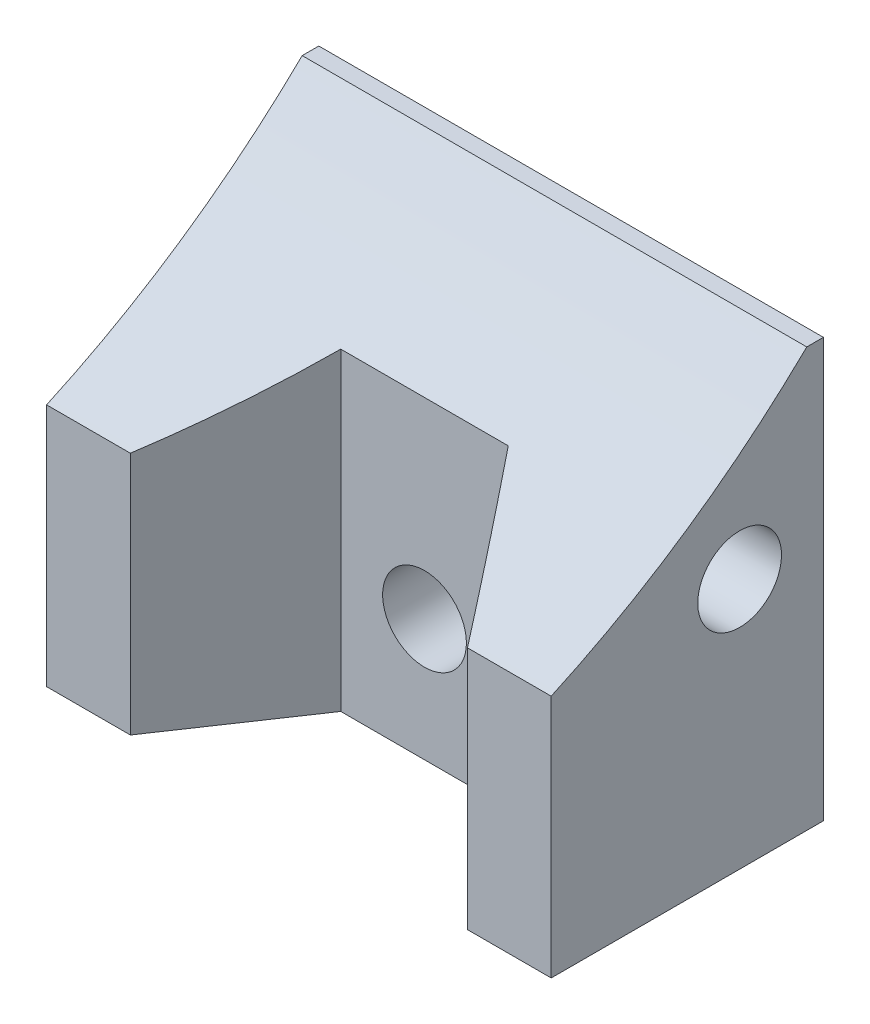
ISO-10303-21;
HEADER;
FILE_DESCRIPTION(('STEP AP214'),'2;1');
FILE_NAME('part.step','',(''),(''),'','','');
FILE_SCHEMA(('AUTOMOTIVE_DESIGN { 1 0 10303 214 1 1 1 1 }'));
ENDSEC;
DATA;
#1=APPLICATION_CONTEXT('core data for automotive mechanical design processes');
#2=APPLICATION_PROTOCOL_DEFINITION('international standard','automotive_design',2000,#1);
#3=PRODUCT_CONTEXT('',#1,'mechanical');
#4=PRODUCT('Part','Part','',(#3));
#5=PRODUCT_RELATED_PRODUCT_CATEGORY('part','',(#4));
#6=PRODUCT_DEFINITION_FORMATION('','',#4);
#7=PRODUCT_DEFINITION_CONTEXT('part definition',#1,'design');
#8=PRODUCT_DEFINITION('design','',#6,#7);
#9=PRODUCT_DEFINITION_SHAPE('','',#8);
#10=(LENGTH_UNIT() NAMED_UNIT(*) SI_UNIT(.MILLI.,.METRE.));
#11=(NAMED_UNIT(*) PLANE_ANGLE_UNIT() SI_UNIT($,.RADIAN.));
#12=(NAMED_UNIT(*) SI_UNIT($,.STERADIAN.) SOLID_ANGLE_UNIT());
#13=UNCERTAINTY_MEASURE_WITH_UNIT(LENGTH_MEASURE(1.E-05),#10,'distance_accuracy_value','');
#14=(GEOMETRIC_REPRESENTATION_CONTEXT(3) GLOBAL_UNCERTAINTY_ASSIGNED_CONTEXT((#13)) GLOBAL_UNIT_ASSIGNED_CONTEXT((#10,
#11,#12)) REPRESENTATION_CONTEXT('',''));
#15=CARTESIAN_POINT('',(0.,0.,0.));
#16=DIRECTION('',(0.,0.,1.));
#17=DIRECTION('',(1.,0.,0.));
#18=AXIS2_PLACEMENT_3D('',#15,#16,#17);
#19=CARTESIAN_POINT('',(0.,0.,13.));
#20=DIRECTION('',(0.,0.,1.));
#21=DIRECTION('',(1.,0.,0.));
#22=AXIS2_PLACEMENT_3D('',#19,#20,#21);
#23=PLANE('',#22);
#24=DIRECTION('',(1.,0.,0.));
#25=VECTOR('',#24,1.);
#26=CARTESIAN_POINT('',(-12.05,1.65718456727979,13.));
#27=LINE('',#26,#25);
#28=CARTESIAN_POINT('',(8.05000000000002,1.65718456727979,13.));
#29=VERTEX_POINT('',#28);
#30=CARTESIAN_POINT('',(12.05,1.65718456727979,13.));
#31=VERTEX_POINT('',#30);
#32=EDGE_CURVE('E143',#29,#31,#27,.T.);
#33=ORIENTED_EDGE('',*,*,#32,.F.);
#34=DIRECTION('',(0.,-1.,0.));
#35=VECTOR('',#34,1.);
#36=CARTESIAN_POINT('',(8.05,10.,13.));
#37=LINE('',#36,#35);
#38=CARTESIAN_POINT('',(8.05,-10.,13.));
#39=VERTEX_POINT('',#38);
#40=EDGE_CURVE('E49',#29,#39,#37,.T.);
#41=ORIENTED_EDGE('',*,*,#40,.T.);
#42=DIRECTION('',(1.,0.,0.));
#43=VECTOR('',#42,1.);
#44=CARTESIAN_POINT('',(-12.05,-10.,13.));
#45=LINE('',#44,#43);
#46=CARTESIAN_POINT('',(12.05,-10.,13.));
#47=VERTEX_POINT('',#46);
#48=EDGE_CURVE('E126',#39,#47,#45,.T.);
#49=ORIENTED_EDGE('',*,*,#48,.T.);
#50=DIRECTION('',(0.,1.,0.));
#51=VECTOR('',#50,1.);
#52=CARTESIAN_POINT('',(12.05,10.,13.));
#53=LINE('',#52,#51);
#54=EDGE_CURVE('E151',#47,#31,#53,.T.);
#55=ORIENTED_EDGE('',*,*,#54,.T.);
#56=EDGE_LOOP('',(#33,#41,#49,#55));
#57=FACE_BOUND('',#56,.T.);
#58=ADVANCED_FACE('F34',(#57),#23,.T.);
#59=CARTESIAN_POINT('',(12.05,10.,13.));
#60=DIRECTION('',(-1.,0.,0.));
#61=DIRECTION('',(0.,-1.,0.));
#62=AXIS2_PLACEMENT_3D('',#59,#60,#61);
#63=PLANE('',#62);
#64=CARTESIAN_POINT('',(12.05,2.00000000000001,4.));
#65=DIRECTION('',(1.,0.,0.));
#66=DIRECTION('',(0.,1.,0.));
#67=AXIS2_PLACEMENT_3D('',#64,#65,#66);
#68=CIRCLE('',#67,2.);
#69=CARTESIAN_POINT('',(12.05,4.00000000000001,4.));
#70=VERTEX_POINT('',#69);
#71=EDGE_CURVE('E244',#70,#70,#68,.T.);
#72=ORIENTED_EDGE('',*,*,#71,.F.);
#73=EDGE_LOOP('',(#72));
#74=FACE_BOUND('',#73,.T.);
#75=DIRECTION('',(0.,0.,-1.));
#76=VECTOR('',#75,1.);
#77=CARTESIAN_POINT('',(12.05,10.,13.));
#78=LINE('',#77,#76);
#79=CARTESIAN_POINT('',(12.05,10.,0.794000599880031));
#80=VERTEX_POINT('',#79);
#81=CARTESIAN_POINT('',(12.05,10.,0.));
#82=VERTEX_POINT('',#81);
#83=EDGE_CURVE('E176',#80,#82,#78,.T.);
#84=ORIENTED_EDGE('',*,*,#83,.F.);
#85=CARTESIAN_POINT('',(12.05,40.8,30.8));
#86=DIRECTION('',(1.,0.,0.));
#87=DIRECTION('',(0.,1.,0.));
#88=AXIS2_PLACEMENT_3D('',#85,#86,#87);
#89=CIRCLE('',#88,43.);
#90=EDGE_CURVE('E141',#31,#80,#89,.T.);
#91=ORIENTED_EDGE('',*,*,#90,.F.);
#92=ORIENTED_EDGE('',*,*,#54,.F.);
#93=DIRECTION('',(0.,0.,-1.));
#94=VECTOR('',#93,1.);
#95=CARTESIAN_POINT('',(12.05,-10.,13.));
#96=LINE('',#95,#94);
#97=CARTESIAN_POINT('',(12.05,-10.,0.));
#98=VERTEX_POINT('',#97);
#99=EDGE_CURVE('E160',#47,#98,#96,.T.);
#100=ORIENTED_EDGE('',*,*,#99,.T.);
#101=DIRECTION('',(0.,1.,0.));
#102=VECTOR('',#101,1.);
#103=CARTESIAN_POINT('',(12.05,10.,0.));
#104=LINE('',#103,#102);
#105=EDGE_CURVE('E148',#98,#82,#104,.T.);
#106=ORIENTED_EDGE('',*,*,#105,.T.);
#107=EDGE_LOOP('',(#84,#91,#92,#100,#106));
#108=FACE_BOUND('',#107,.T.);
#109=ADVANCED_FACE('F36',(#74,#108),#63,.F.);
#110=CARTESIAN_POINT('',(-12.05,10.,13.));
#111=DIRECTION('',(0.,-1.,0.));
#112=DIRECTION('',(0.,0.,-1.));
#113=AXIS2_PLACEMENT_3D('',#110,#111,#112);
#114=PLANE('',#113);
#115=DIRECTION('',(0.,0.,-1.));
#116=VECTOR('',#115,1.);
#117=CARTESIAN_POINT('',(-12.05,10.,13.));
#118=LINE('',#117,#116);
#119=CARTESIAN_POINT('',(-12.05,10.,0.794000599880031));
#120=VERTEX_POINT('',#119);
#121=CARTESIAN_POINT('',(-12.05,10.,0.));
#122=VERTEX_POINT('',#121);
#123=EDGE_CURVE('E174',#120,#122,#118,.T.);
#124=ORIENTED_EDGE('',*,*,#123,.F.);
#125=DIRECTION('',(1.,0.,0.));
#126=VECTOR('',#125,1.);
#127=CARTESIAN_POINT('',(-12.05,10.,0.794000599880031));
#128=LINE('',#127,#126);
#129=EDGE_CURVE('E145',#120,#80,#128,.T.);
#130=ORIENTED_EDGE('',*,*,#129,.T.);
#131=ORIENTED_EDGE('',*,*,#83,.T.);
#132=DIRECTION('',(-1.,0.,0.));
#133=VECTOR('',#132,1.);
#134=CARTESIAN_POINT('',(-12.05,10.,0.));
#135=LINE('',#134,#133);
#136=EDGE_CURVE('E163',#82,#122,#135,.T.);
#137=ORIENTED_EDGE('',*,*,#136,.T.);
#138=EDGE_LOOP('',(#124,#130,#131,#137));
#139=FACE_BOUND('',#138,.T.);
#140=ADVANCED_FACE('F203',(#139),#114,.F.);
#141=CARTESIAN_POINT('',(-12.05,10.,13.));
#142=DIRECTION('',(1.,0.,0.));
#143=DIRECTION('',(0.,1.,0.));
#144=AXIS2_PLACEMENT_3D('',#141,#142,#143);
#145=PLANE('',#144);
#146=CARTESIAN_POINT('',(-12.05,2.00000000000001,4.));
#147=DIRECTION('',(1.,0.,0.));
#148=DIRECTION('',(0.,1.,0.));
#149=AXIS2_PLACEMENT_3D('',#146,#147,#148);
#150=CIRCLE('',#149,2.);
#151=CARTESIAN_POINT('',(-12.05,4.00000000000001,4.));
#152=VERTEX_POINT('',#151);
#153=EDGE_CURVE('E121',#152,#152,#150,.T.);
#154=ORIENTED_EDGE('',*,*,#153,.T.);
#155=EDGE_LOOP('',(#154));
#156=FACE_BOUND('',#155,.T.);
#157=DIRECTION('',(0.,-1.,0.));
#158=VECTOR('',#157,1.);
#159=CARTESIAN_POINT('',(-12.05,10.,13.));
#160=LINE('',#159,#158);
#161=CARTESIAN_POINT('',(-12.05,1.65718456727979,13.));
#162=VERTEX_POINT('',#161);
#163=CARTESIAN_POINT('',(-12.05,-10.,13.));
#164=VERTEX_POINT('',#163);
#165=EDGE_CURVE('E154',#162,#164,#160,.T.);
#166=ORIENTED_EDGE('',*,*,#165,.F.);
#167=CARTESIAN_POINT('',(-12.05,40.8,30.8));
#168=DIRECTION('',(1.,0.,0.));
#169=DIRECTION('',(0.,1.,0.));
#170=AXIS2_PLACEMENT_3D('',#167,#168,#169);
#171=CIRCLE('',#170,43.);
#172=EDGE_CURVE('E57',#162,#120,#171,.T.);
#173=ORIENTED_EDGE('',*,*,#172,.T.);
#174=ORIENTED_EDGE('',*,*,#123,.T.);
#175=DIRECTION('',(0.,-1.,0.));
#176=VECTOR('',#175,1.);
#177=CARTESIAN_POINT('',(-12.05,10.,0.));
#178=LINE('',#177,#176);
#179=CARTESIAN_POINT('',(-12.05,-10.,0.));
#180=VERTEX_POINT('',#179);
#181=EDGE_CURVE('E166',#122,#180,#178,.T.);
#182=ORIENTED_EDGE('',*,*,#181,.T.);
#183=DIRECTION('',(0.,0.,-1.));
#184=VECTOR('',#183,1.);
#185=CARTESIAN_POINT('',(-12.05,-10.,13.));
#186=LINE('',#185,#184);
#187=EDGE_CURVE('E171',#164,#180,#186,.T.);
#188=ORIENTED_EDGE('',*,*,#187,.F.);
#189=EDGE_LOOP('',(#166,#173,#174,#182,#188));
#190=FACE_BOUND('',#189,.T.);
#191=ADVANCED_FACE('F217',(#156,#190),#145,.F.);
#192=CARTESIAN_POINT('',(-12.05,-10.,13.));
#193=DIRECTION('',(0.,1.,0.));
#194=DIRECTION('',(0.,0.,1.));
#195=AXIS2_PLACEMENT_3D('',#192,#193,#194);
#196=PLANE('',#195);
#197=DIRECTION('',(1.,0.,0.));
#198=VECTOR('',#197,1.);
#199=CARTESIAN_POINT('',(0.,-10.,7.));
#200=LINE('',#199,#198);
#201=CARTESIAN_POINT('',(-4.,-10.,7.));
#202=VERTEX_POINT('',#201);
#203=CARTESIAN_POINT('',(4.,-10.,7.));
#204=VERTEX_POINT('',#203);
#205=EDGE_CURVE('E114',#202,#204,#200,.T.);
#206=ORIENTED_EDGE('',*,*,#205,.F.);
#207=DIRECTION('',(0.559472855001062,0.,-0.828848674075648));
#208=VECTOR('',#207,1.);
#209=CARTESIAN_POINT('',(0.498067840274794,-10.,0.336195792185485));
#210=LINE('',#209,#208);
#211=CARTESIAN_POINT('',(-8.05,-10.,13.));
#212=VERTEX_POINT('',#211);
#213=EDGE_CURVE('E111',#212,#202,#210,.T.);
#214=ORIENTED_EDGE('',*,*,#213,.F.);
#215=EDGE_CURVE('E157',#164,#212,#45,.T.);
#216=ORIENTED_EDGE('',*,*,#215,.F.);
#217=ORIENTED_EDGE('',*,*,#187,.T.);
#218=DIRECTION('',(1.,0.,0.));
#219=VECTOR('',#218,1.);
#220=CARTESIAN_POINT('',(-12.05,-10.,0.));
#221=LINE('',#220,#219);
#222=EDGE_CURVE('E155',#180,#98,#221,.T.);
#223=ORIENTED_EDGE('',*,*,#222,.T.);
#224=ORIENTED_EDGE('',*,*,#99,.F.);
#225=ORIENTED_EDGE('',*,*,#48,.F.);
#226=DIRECTION('',(-0.559472855001063,0.,-0.828848674075648));
#227=VECTOR('',#226,1.);
#228=CARTESIAN_POINT('',(-0.498067840274802,-10.,0.336195792185492));
#229=LINE('',#228,#227);
#230=EDGE_CURVE('E108',#39,#204,#229,.T.);
#231=ORIENTED_EDGE('',*,*,#230,.T.);
#232=EDGE_LOOP('',(#206,#214,#216,#217,#223,#224,#225,#231));
#233=FACE_BOUND('',#232,.T.);
#234=ADVANCED_FACE('F124',(#233),#196,.F.);
#235=DIRECTION('',(0.,-1.,0.));
#236=VECTOR('',#235,1.);
#237=CARTESIAN_POINT('',(-8.05,10.,13.));
#238=LINE('',#237,#236);
#239=CARTESIAN_POINT('',(-8.05,1.65718456727979,13.));
#240=VERTEX_POINT('',#239);
#241=EDGE_CURVE('E133',#240,#212,#238,.T.);
#242=ORIENTED_EDGE('',*,*,#241,.F.);
#243=EDGE_CURVE('E149',#162,#240,#27,.T.);
#244=ORIENTED_EDGE('',*,*,#243,.F.);
#245=ORIENTED_EDGE('',*,*,#165,.T.);
#246=ORIENTED_EDGE('',*,*,#215,.T.);
#247=EDGE_LOOP('',(#242,#244,#245,#246));
#248=FACE_BOUND('',#247,.T.);
#249=ADVANCED_FACE('F199',(#248),#23,.T.);
#250=CARTESIAN_POINT('',(0.,0.,0.));
#251=DIRECTION('',(0.,0.,1.));
#252=DIRECTION('',(1.,0.,0.));
#253=AXIS2_PLACEMENT_3D('',#250,#251,#252);
#254=PLANE('',#253);
#255=CARTESIAN_POINT('',(0.,-4.1714077163601,0.));
#256=DIRECTION('',(0.,0.,1.));
#257=DIRECTION('',(1.,0.,0.));
#258=AXIS2_PLACEMENT_3D('',#255,#256,#257);
#259=CIRCLE('',#258,2.);
#260=CARTESIAN_POINT('',(2.,-4.1714077163601,0.));
#261=VERTEX_POINT('',#260);
#262=EDGE_CURVE('E138',#261,#261,#259,.T.);
#263=ORIENTED_EDGE('',*,*,#262,.T.);
#264=EDGE_LOOP('',(#263));
#265=FACE_BOUND('',#264,.T.);
#266=ORIENTED_EDGE('',*,*,#105,.F.);
#267=ORIENTED_EDGE('',*,*,#222,.F.);
#268=ORIENTED_EDGE('',*,*,#181,.F.);
#269=ORIENTED_EDGE('',*,*,#136,.F.);
#270=EDGE_LOOP('',(#266,#267,#268,#269));
#271=FACE_BOUND('',#270,.T.);
#272=ADVANCED_FACE('F209',(#265,#271),#254,.F.);
#273=CARTESIAN_POINT('',(-12.05,40.8,30.8));
#274=DIRECTION('',(1.,0.,0.));
#275=DIRECTION('',(0.,1.,0.));
#276=AXIS2_PLACEMENT_3D('',#273,#274,#275);
#277=CYLINDRICAL_SURFACE('',#276,43.);
#278=ORIENTED_EDGE('',*,*,#243,.T.);
#279=CARTESIAN_POINT('',(-20.065,40.8,30.8));
#280=DIRECTION('',(-0.828848674075648,0.,-0.559472855001062));
#281=DIRECTION('',(0.559472855001062,0.,-0.828848674075648));
#282=AXIS2_PLACEMENT_3D('',#279,#280,#281);
#283=ELLIPSE('',#282,51.8791926016587,43.);
#284=CARTESIAN_POINT('',(-4.,4.98715314304099,7.));
#285=VERTEX_POINT('',#284);
#286=EDGE_CURVE('E11',#240,#285,#283,.F.);
#287=ORIENTED_EDGE('',*,*,#286,.T.);
#288=DIRECTION('',(1.,0.,0.));
#289=VECTOR('',#288,1.);
#290=CARTESIAN_POINT('',(-12.05,4.98715314304098,7.));
#291=LINE('',#290,#289);
#292=CARTESIAN_POINT('',(4.,4.98715314304098,7.));
#293=VERTEX_POINT('',#292);
#294=EDGE_CURVE('E136',#285,#293,#291,.T.);
#295=ORIENTED_EDGE('',*,*,#294,.T.);
#296=CARTESIAN_POINT('',(20.065,40.8,30.8));
#297=DIRECTION('',(-0.828848674075648,0.,0.559472855001063));
#298=DIRECTION('',(0.559472855001063,0.,0.828848674075648));
#299=AXIS2_PLACEMENT_3D('',#296,#297,#298);
#300=ELLIPSE('',#299,51.8791926016587,43.);
#301=EDGE_CURVE('E42',#29,#293,#300,.F.);
#302=ORIENTED_EDGE('',*,*,#301,.F.);
#303=ORIENTED_EDGE('',*,*,#32,.T.);
#304=ORIENTED_EDGE('',*,*,#90,.T.);
#305=ORIENTED_EDGE('',*,*,#129,.F.);
#306=ORIENTED_EDGE('',*,*,#172,.F.);
#307=EDGE_LOOP('',(#278,#287,#295,#302,#303,#304,#305,#306));
#308=FACE_BOUND('',#307,.T.);
#309=ADVANCED_FACE('F215',(#308),#277,.F.);
#310=CARTESIAN_POINT('',(0.,-4.1714077163601,0.));
#311=DIRECTION('',(0.,0.,1.));
#312=DIRECTION('',(1.,0.,0.));
#313=AXIS2_PLACEMENT_3D('',#310,#311,#312);
#314=CYLINDRICAL_SURFACE('',#313,2.);
#315=CARTESIAN_POINT('',(0.,-4.1714077163601,7.));
#316=DIRECTION('',(0.,0.,-1.));
#317=DIRECTION('',(-1.,0.,0.));
#318=AXIS2_PLACEMENT_3D('',#315,#316,#317);
#319=CIRCLE('',#318,2.);
#320=CARTESIAN_POINT('',(2.,-4.1714077163601,7.));
#321=VERTEX_POINT('',#320);
#322=EDGE_CURVE('E132',#321,#321,#319,.F.);
#323=CARTESIAN_POINT('',(2.,-4.1714077163601,7.));
#324=CARTESIAN_POINT('',(2.,-4.1714077163601,6.92708333333333));
#325=CARTESIAN_POINT('',(2.,-4.1714077163601,6.85416666666667));
#326=CARTESIAN_POINT('',(2.,-4.1714077163601,6.70833333333333));
#327=CARTESIAN_POINT('',(2.,-4.1714077163601,6.63541666666667));
#328=CARTESIAN_POINT('',(2.,-4.1714077163601,6.48958333333333));
#329=CARTESIAN_POINT('',(2.,-4.1714077163601,6.41666666666667));
#330=CARTESIAN_POINT('',(2.,-4.1714077163601,6.27083333333333));
#331=CARTESIAN_POINT('',(2.,-4.1714077163601,6.19791666666667));
#332=CARTESIAN_POINT('',(2.,-4.1714077163601,6.05208333333333));
#333=CARTESIAN_POINT('',(2.,-4.1714077163601,5.97916666666667));
#334=CARTESIAN_POINT('',(2.,-4.1714077163601,5.83333333333333));
#335=CARTESIAN_POINT('',(2.,-4.1714077163601,5.76041666666667));
#336=CARTESIAN_POINT('',(2.,-4.1714077163601,5.61458333333333));
#337=CARTESIAN_POINT('',(2.,-4.1714077163601,5.54166666666667));
#338=CARTESIAN_POINT('',(2.,-4.1714077163601,5.39583333333333));
#339=CARTESIAN_POINT('',(2.,-4.1714077163601,5.32291666666667));
#340=CARTESIAN_POINT('',(2.,-4.1714077163601,5.17708333333333));
#341=CARTESIAN_POINT('',(2.,-4.1714077163601,5.10416666666667));
#342=CARTESIAN_POINT('',(2.,-4.1714077163601,4.95833333333333));
#343=CARTESIAN_POINT('',(2.,-4.1714077163601,4.88541666666667));
#344=CARTESIAN_POINT('',(2.,-4.1714077163601,4.73958333333333));
#345=CARTESIAN_POINT('',(2.,-4.1714077163601,4.66666666666667));
#346=CARTESIAN_POINT('',(2.,-4.1714077163601,4.52083333333333));
#347=CARTESIAN_POINT('',(2.,-4.1714077163601,4.44791666666667));
#348=CARTESIAN_POINT('',(2.,-4.1714077163601,4.30208333333333));
#349=CARTESIAN_POINT('',(2.,-4.1714077163601,4.22916666666667));
#350=CARTESIAN_POINT('',(2.,-4.1714077163601,4.08333333333333));
#351=CARTESIAN_POINT('',(2.,-4.1714077163601,4.01041666666667));
#352=CARTESIAN_POINT('',(2.,-4.1714077163601,3.86458333333333));
#353=CARTESIAN_POINT('',(2.,-4.1714077163601,3.79166666666667));
#354=CARTESIAN_POINT('',(2.,-4.1714077163601,3.64583333333333));
#355=CARTESIAN_POINT('',(2.,-4.1714077163601,3.57291666666667));
#356=CARTESIAN_POINT('',(2.,-4.1714077163601,3.42708333333333));
#357=CARTESIAN_POINT('',(2.,-4.1714077163601,3.35416666666667));
#358=CARTESIAN_POINT('',(2.,-4.1714077163601,3.20833333333333));
#359=CARTESIAN_POINT('',(2.,-4.1714077163601,3.13541666666667));
#360=CARTESIAN_POINT('',(2.,-4.1714077163601,2.98958333333333));
#361=CARTESIAN_POINT('',(2.,-4.1714077163601,2.91666666666667));
#362=CARTESIAN_POINT('',(2.,-4.1714077163601,2.77083333333333));
#363=CARTESIAN_POINT('',(2.,-4.1714077163601,2.69791666666667));
#364=CARTESIAN_POINT('',(2.,-4.1714077163601,2.55208333333333));
#365=CARTESIAN_POINT('',(2.,-4.1714077163601,2.47916666666667));
#366=CARTESIAN_POINT('',(2.,-4.1714077163601,2.33333333333333));
#367=CARTESIAN_POINT('',(2.,-4.1714077163601,2.26041666666667));
#368=CARTESIAN_POINT('',(2.,-4.1714077163601,2.11458333333333));
#369=CARTESIAN_POINT('',(2.,-4.1714077163601,2.04166666666667));
#370=CARTESIAN_POINT('',(2.,-4.1714077163601,1.89583333333333));
#371=CARTESIAN_POINT('',(2.,-4.1714077163601,1.82291666666667));
#372=CARTESIAN_POINT('',(2.,-4.1714077163601,1.67708333333333));
#373=CARTESIAN_POINT('',(2.,-4.1714077163601,1.60416666666667));
#374=CARTESIAN_POINT('',(2.,-4.1714077163601,1.45833333333333));
#375=CARTESIAN_POINT('',(2.,-4.1714077163601,1.38541666666667));
#376=CARTESIAN_POINT('',(2.,-4.1714077163601,1.23958333333333));
#377=CARTESIAN_POINT('',(2.,-4.1714077163601,1.16666666666667));
#378=CARTESIAN_POINT('',(2.,-4.1714077163601,1.02083333333333));
#379=CARTESIAN_POINT('',(2.,-4.1714077163601,0.947916666666666));
#380=CARTESIAN_POINT('',(2.,-4.1714077163601,0.802083333333333));
#381=CARTESIAN_POINT('',(2.,-4.1714077163601,0.729166666666666));
#382=CARTESIAN_POINT('',(2.,-4.1714077163601,0.583333333333333));
#383=CARTESIAN_POINT('',(2.,-4.1714077163601,0.510416666666667));
#384=CARTESIAN_POINT('',(2.,-4.1714077163601,0.364583333333334));
#385=CARTESIAN_POINT('',(2.,-4.1714077163601,0.291666666666667));
#386=CARTESIAN_POINT('',(2.,-4.1714077163601,0.145833333333333));
#387=CARTESIAN_POINT('',(2.,-4.1714077163601,0.0729166666666667));
#388=CARTESIAN_POINT('',(2.,-4.1714077163601,0.));
#389=B_SPLINE_CURVE_WITH_KNOTS('',3,(#323,#324,#325,#326,#327,#328,#329,#330,#331,#332,#333,
#334,#335,#336,#337,#338,#339,#340,#341,#342,#343,#344,#345,#346,#347,#348,#349,#350,#351,#352,
#353,#354,#355,#356,#357,#358,#359,#360,#361,#362,#363,#364,#365,#366,#367,#368,#369,#370,#371,
#372,#373,#374,#375,#376,#377,#378,#379,#380,#381,#382,#383,#384,#385,#386,#387,#388),
.UNSPECIFIED.,.F.,.F.,(4,2,2,2,2,2,2,2,2,2,2,2,2,2,2,2,2,2,2,2,2,2,2,2,2,2,2,2,2,2,2,2,4),(0.,
0.21875,0.4375,0.656250000000001,0.875,1.09375,1.3125,1.53125,1.75,1.96875,2.1875,2.40625,2.625,
2.84375,3.0625,3.28125,3.5,3.71875,3.9375,4.15625,4.375,4.59375,4.8125,5.03125,5.25,5.46875,
5.6875,5.90625,6.125,6.34375,6.5625,6.78125,7.),.UNSPECIFIED.);
#390=EDGE_CURVE('BSEAM181',#321,#261,#389,.T.);
#391=ORIENTED_EDGE('',*,*,#322,.T.);
#392=ORIENTED_EDGE('',*,*,#262,.F.);
#393=ORIENTED_EDGE('',*,*,#390,.T.);
#394=ORIENTED_EDGE('',*,*,#390,.F.);
#395=EDGE_LOOP('',(#391,#393,#392,#394));
#396=FACE_BOUND('',#395,.T.);
#397=ADVANCED_FACE('F181',(#396),#314,.F.);
#398=CARTESIAN_POINT('',(0.498067840274794,10.,0.336195792185485));
#399=DIRECTION('',(-0.828848674075648,0.,-0.559472855001062));
#400=DIRECTION('',(-0.559472855001062,0.,0.828848674075648));
#401=AXIS2_PLACEMENT_3D('',#398,#399,#400);
#402=PLANE('',#401);
#403=ORIENTED_EDGE('',*,*,#241,.T.);
#404=ORIENTED_EDGE('',*,*,#213,.T.);
#405=DIRECTION('',(0.,-1.,0.));
#406=VECTOR('',#405,1.);
#407=CARTESIAN_POINT('',(-4.,10.,7.));
#408=LINE('',#407,#406);
#409=EDGE_CURVE('E117',#285,#202,#408,.T.);
#410=ORIENTED_EDGE('',*,*,#409,.F.);
#411=ORIENTED_EDGE('',*,*,#286,.F.);
#412=EDGE_LOOP('',(#403,#404,#410,#411));
#413=FACE_BOUND('',#412,.T.);
#414=ADVANCED_FACE('F193',(#413),#402,.F.);
#415=CARTESIAN_POINT('',(-0.498067840274802,10.,0.336195792185492));
#416=DIRECTION('',(-0.828848674075648,0.,0.559472855001063));
#417=DIRECTION('',(0.559472855001063,0.,0.828848674075648));
#418=AXIS2_PLACEMENT_3D('',#415,#416,#417);
#419=PLANE('',#418);
#420=ORIENTED_EDGE('',*,*,#301,.T.);
#421=DIRECTION('',(0.,-1.,0.));
#422=VECTOR('',#421,1.);
#423=CARTESIAN_POINT('',(4.,10.,7.));
#424=LINE('',#423,#422);
#425=EDGE_CURVE('E104',#293,#204,#424,.T.);
#426=ORIENTED_EDGE('',*,*,#425,.T.);
#427=ORIENTED_EDGE('',*,*,#230,.F.);
#428=ORIENTED_EDGE('',*,*,#40,.F.);
#429=EDGE_LOOP('',(#420,#426,#427,#428));
#430=FACE_BOUND('',#429,.T.);
#431=ADVANCED_FACE('F106',(#430),#419,.T.);
#432=CARTESIAN_POINT('',(0.,10.,7.));
#433=DIRECTION('',(0.,0.,-1.));
#434=DIRECTION('',(-1.,0.,0.));
#435=AXIS2_PLACEMENT_3D('',#432,#433,#434);
#436=PLANE('',#435);
#437=ORIENTED_EDGE('',*,*,#322,.F.);
#438=EDGE_LOOP('',(#437));
#439=FACE_BOUND('',#438,.T.);
#440=ORIENTED_EDGE('',*,*,#409,.T.);
#441=ORIENTED_EDGE('',*,*,#205,.T.);
#442=ORIENTED_EDGE('',*,*,#425,.F.);
#443=ORIENTED_EDGE('',*,*,#294,.F.);
#444=EDGE_LOOP('',(#440,#441,#442,#443));
#445=FACE_BOUND('',#444,.T.);
#446=ADVANCED_FACE('F115',(#439,#445),#436,.F.);
#447=CARTESIAN_POINT('',(-12.05,2.00000000000001,4.));
#448=DIRECTION('',(1.,0.,0.));
#449=DIRECTION('',(0.,1.,0.));
#450=AXIS2_PLACEMENT_3D('',#447,#448,#449);
#451=CYLINDRICAL_SURFACE('',#450,2.);
#452=ORIENTED_EDGE('',*,*,#153,.F.);
#453=EDGE_LOOP('',(#452));
#454=FACE_BOUND('',#453,.T.);
#455=ORIENTED_EDGE('',*,*,#71,.T.);
#456=EDGE_LOOP('',(#455));
#457=FACE_BOUND('',#456,.T.);
#458=ADVANCED_FACE('F185',(#454,#457),#451,.F.);
#459=CLOSED_SHELL('',(#58,#109,#140,#191,#234,#249,#272,#309,#397,#414,#431,#446,#458));
#460=MANIFOLD_SOLID_BREP('B2',#459);
#461=ADVANCED_BREP_SHAPE_REPRESENTATION('',(#18,#460),#14);
#462=SHAPE_DEFINITION_REPRESENTATION(#9,#461);
ENDSEC;
END-ISO-10303-21;
